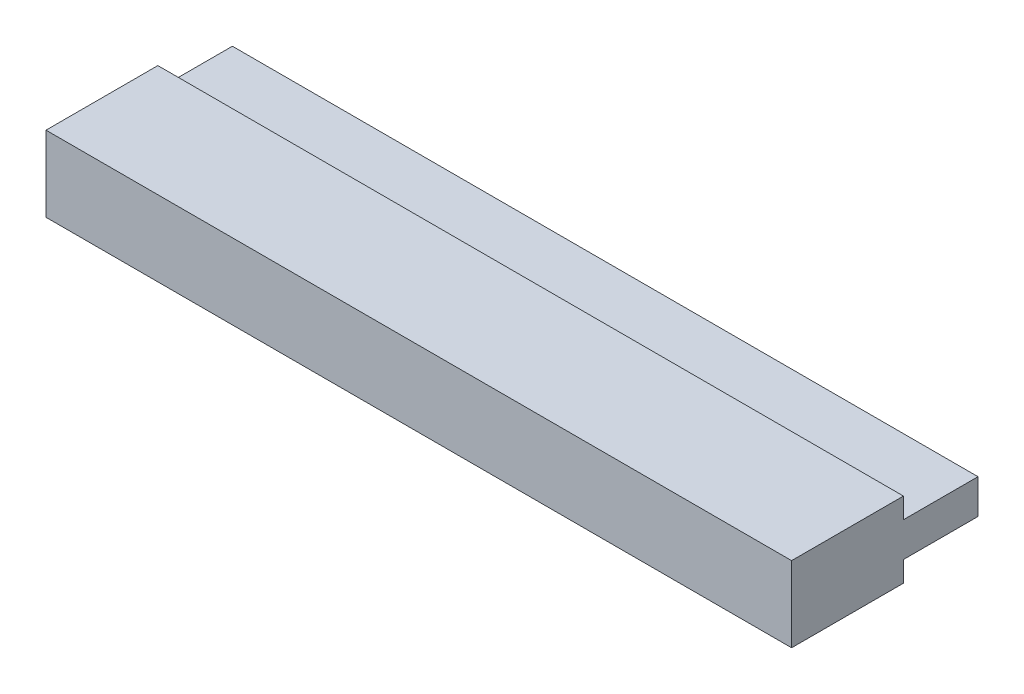
ISO-10303-21;
HEADER;
FILE_DESCRIPTION(('STEP AP214'),'2;1');
FILE_NAME('part.step','',(''),(''),'','','');
FILE_SCHEMA(('AUTOMOTIVE_DESIGN { 1 0 10303 214 1 1 1 1 }'));
ENDSEC;
DATA;
#1=APPLICATION_CONTEXT('core data for automotive mechanical design processes');
#2=APPLICATION_PROTOCOL_DEFINITION('international standard','automotive_design',2000,#1);
#3=PRODUCT_CONTEXT('',#1,'mechanical');
#4=PRODUCT('Part','Part','',(#3));
#5=PRODUCT_RELATED_PRODUCT_CATEGORY('part','',(#4));
#6=PRODUCT_DEFINITION_FORMATION('','',#4);
#7=PRODUCT_DEFINITION_CONTEXT('part definition',#1,'design');
#8=PRODUCT_DEFINITION('design','',#6,#7);
#9=PRODUCT_DEFINITION_SHAPE('','',#8);
#10=(LENGTH_UNIT() NAMED_UNIT(*) SI_UNIT(.MILLI.,.METRE.));
#11=(NAMED_UNIT(*) PLANE_ANGLE_UNIT() SI_UNIT($,.RADIAN.));
#12=(NAMED_UNIT(*) SI_UNIT($,.STERADIAN.) SOLID_ANGLE_UNIT());
#13=UNCERTAINTY_MEASURE_WITH_UNIT(LENGTH_MEASURE(1.E-05),#10,'distance_accuracy_value','');
#14=(GEOMETRIC_REPRESENTATION_CONTEXT(3) GLOBAL_UNCERTAINTY_ASSIGNED_CONTEXT((#13)) GLOBAL_UNIT_ASSIGNED_CONTEXT((#10,
#11,#12)) REPRESENTATION_CONTEXT('',''));
#15=CARTESIAN_POINT('',(0.,0.,0.));
#16=DIRECTION('',(0.,0.,1.));
#17=DIRECTION('',(1.,0.,0.));
#18=AXIS2_PLACEMENT_3D('',#15,#16,#17);
#19=CARTESIAN_POINT('',(0.,0.,20.));
#20=DIRECTION('',(1.,0.,0.));
#21=DIRECTION('',(0.,0.,-1.));
#22=AXIS2_PLACEMENT_3D('',#19,#20,#21);
#23=PLANE('',#22);
#24=DIRECTION('',(0.,0.,-1.));
#25=VECTOR('',#24,1.);
#26=CARTESIAN_POINT('',(0.,8.1,20.));
#27=LINE('',#26,#25);
#28=CARTESIAN_POINT('',(0.,8.1,20.));
#29=VERTEX_POINT('',#28);
#30=CARTESIAN_POINT('',(0.,8.1,8.));
#31=VERTEX_POINT('',#30);
#32=EDGE_CURVE('E139',#29,#31,#27,.T.);
#33=ORIENTED_EDGE('',*,*,#32,.T.);
#34=DIRECTION('',(0.,1.,0.));
#35=VECTOR('',#34,1.);
#36=CARTESIAN_POINT('',(0.,8.1,8.));
#37=LINE('',#36,#35);
#38=CARTESIAN_POINT('',(0.,5.9,8.));
#39=VERTEX_POINT('',#38);
#40=EDGE_CURVE('E120',#39,#31,#37,.T.);
#41=ORIENTED_EDGE('',*,*,#40,.F.);
#42=DIRECTION('',(0.,0.,1.));
#43=VECTOR('',#42,1.);
#44=CARTESIAN_POINT('',(0.,5.9,8.));
#45=LINE('',#44,#43);
#46=CARTESIAN_POINT('',(0.,5.9,0.));
#47=VERTEX_POINT('',#46);
#48=EDGE_CURVE('E108',#47,#39,#45,.T.);
#49=ORIENTED_EDGE('',*,*,#48,.F.);
#50=DIRECTION('',(0.,-1.,0.));
#51=VECTOR('',#50,1.);
#52=CARTESIAN_POINT('',(0.,0.,0.));
#53=LINE('',#52,#51);
#54=CARTESIAN_POINT('',(0.,2.2,0.));
#55=VERTEX_POINT('',#54);
#56=EDGE_CURVE('E119',#47,#55,#53,.T.);
#57=ORIENTED_EDGE('',*,*,#56,.T.);
#58=DIRECTION('',(0.,0.,-1.));
#59=VECTOR('',#58,1.);
#60=CARTESIAN_POINT('',(0.,2.2,1.00646922424426));
#61=LINE('',#60,#59);
#62=CARTESIAN_POINT('',(0.,2.2,8.));
#63=VERTEX_POINT('',#62);
#64=EDGE_CURVE('E65',#63,#55,#61,.T.);
#65=ORIENTED_EDGE('',*,*,#64,.F.);
#66=DIRECTION('',(0.,1.,0.));
#67=VECTOR('',#66,1.);
#68=CARTESIAN_POINT('',(0.,2.2,8.));
#69=LINE('',#68,#67);
#70=CARTESIAN_POINT('',(0.,0.,8.));
#71=VERTEX_POINT('',#70);
#72=EDGE_CURVE('E122',#71,#63,#69,.T.);
#73=ORIENTED_EDGE('',*,*,#72,.F.);
#74=DIRECTION('',(0.,0.,-1.));
#75=VECTOR('',#74,1.);
#76=CARTESIAN_POINT('',(0.,0.,20.));
#77=LINE('',#76,#75);
#78=CARTESIAN_POINT('',(0.,0.,20.));
#79=VERTEX_POINT('',#78);
#80=EDGE_CURVE('E150',#79,#71,#77,.T.);
#81=ORIENTED_EDGE('',*,*,#80,.F.);
#82=DIRECTION('',(0.,-1.,0.));
#83=VECTOR('',#82,1.);
#84=CARTESIAN_POINT('',(0.,0.,20.));
#85=LINE('',#84,#83);
#86=EDGE_CURVE('E131',#29,#79,#85,.T.);
#87=ORIENTED_EDGE('',*,*,#86,.F.);
#88=EDGE_LOOP('',(#33,#41,#49,#57,#65,#73,#81,#87));
#89=FACE_BOUND('',#88,.T.);
#90=ADVANCED_FACE('F42',(#89),#23,.F.);
#91=CARTESIAN_POINT('',(0.,0.,20.));
#92=DIRECTION('',(0.,1.,0.));
#93=DIRECTION('',(0.,0.,1.));
#94=AXIS2_PLACEMENT_3D('',#91,#92,#93);
#95=PLANE('',#94);
#96=ORIENTED_EDGE('',*,*,#80,.T.);
#97=DIRECTION('',(-1.,0.,0.));
#98=VECTOR('',#97,1.);
#99=CARTESIAN_POINT('',(85.,0.,8.));
#100=LINE('',#99,#98);
#101=CARTESIAN_POINT('',(80.,0.,8.));
#102=VERTEX_POINT('',#101);
#103=EDGE_CURVE('E197',#102,#71,#100,.T.);
#104=ORIENTED_EDGE('',*,*,#103,.F.);
#105=DIRECTION('',(0.,0.,-1.));
#106=VECTOR('',#105,1.);
#107=CARTESIAN_POINT('',(80.,0.,20.));
#108=LINE('',#107,#106);
#109=CARTESIAN_POINT('',(80.,0.,20.));
#110=VERTEX_POINT('',#109);
#111=EDGE_CURVE('E146',#110,#102,#108,.T.);
#112=ORIENTED_EDGE('',*,*,#111,.F.);
#113=DIRECTION('',(1.,0.,0.));
#114=VECTOR('',#113,1.);
#115=CARTESIAN_POINT('',(0.,0.,20.));
#116=LINE('',#115,#114);
#117=EDGE_CURVE('E176',#79,#110,#116,.T.);
#118=ORIENTED_EDGE('',*,*,#117,.F.);
#119=EDGE_LOOP('',(#96,#104,#112,#118));
#120=FACE_BOUND('',#119,.T.);
#121=ADVANCED_FACE('F195',(#120),#95,.F.);
#122=CARTESIAN_POINT('',(80.,0.,20.));
#123=DIRECTION('',(-1.,0.,0.));
#124=DIRECTION('',(0.,0.,1.));
#125=AXIS2_PLACEMENT_3D('',#122,#123,#124);
#126=PLANE('',#125);
#127=DIRECTION('',(0.,0.,1.));
#128=VECTOR('',#127,1.);
#129=CARTESIAN_POINT('',(80.,5.9,20.));
#130=LINE('',#129,#128);
#131=CARTESIAN_POINT('',(80.,5.9,0.));
#132=VERTEX_POINT('',#131);
#133=CARTESIAN_POINT('',(80.,5.9,8.));
#134=VERTEX_POINT('',#133);
#135=EDGE_CURVE('E57',#132,#134,#130,.T.);
#136=ORIENTED_EDGE('',*,*,#135,.T.);
#137=DIRECTION('',(0.,1.,0.));
#138=VECTOR('',#137,1.);
#139=CARTESIAN_POINT('',(80.,0.,8.));
#140=LINE('',#139,#138);
#141=CARTESIAN_POINT('',(80.,8.1,8.));
#142=VERTEX_POINT('',#141);
#143=EDGE_CURVE('E127',#134,#142,#140,.T.);
#144=ORIENTED_EDGE('',*,*,#143,.T.);
#145=DIRECTION('',(0.,0.,-1.));
#146=VECTOR('',#145,1.);
#147=CARTESIAN_POINT('',(80.,8.1,20.));
#148=LINE('',#147,#146);
#149=CARTESIAN_POINT('',(80.,8.1,20.));
#150=VERTEX_POINT('',#149);
#151=EDGE_CURVE('E142',#150,#142,#148,.T.);
#152=ORIENTED_EDGE('',*,*,#151,.F.);
#153=DIRECTION('',(0.,1.,0.));
#154=VECTOR('',#153,1.);
#155=CARTESIAN_POINT('',(80.,0.,20.));
#156=LINE('',#155,#154);
#157=EDGE_CURVE('E178',#110,#150,#156,.T.);
#158=ORIENTED_EDGE('',*,*,#157,.F.);
#159=ORIENTED_EDGE('',*,*,#111,.T.);
#160=DIRECTION('',(0.,1.,0.));
#161=VECTOR('',#160,1.);
#162=CARTESIAN_POINT('',(80.,0.,8.));
#163=LINE('',#162,#161);
#164=CARTESIAN_POINT('',(80.,2.2,8.));
#165=VERTEX_POINT('',#164);
#166=EDGE_CURVE('E11',#102,#165,#163,.T.);
#167=ORIENTED_EDGE('',*,*,#166,.T.);
#168=DIRECTION('',(0.,0.,-1.));
#169=VECTOR('',#168,1.);
#170=CARTESIAN_POINT('',(80.,2.2,20.));
#171=LINE('',#170,#169);
#172=CARTESIAN_POINT('',(80.,2.2,0.));
#173=VERTEX_POINT('',#172);
#174=EDGE_CURVE('E157',#165,#173,#171,.T.);
#175=ORIENTED_EDGE('',*,*,#174,.T.);
#176=DIRECTION('',(0.,1.,0.));
#177=VECTOR('',#176,1.);
#178=CARTESIAN_POINT('',(80.,0.,0.));
#179=LINE('',#178,#177);
#180=EDGE_CURVE('E126',#173,#132,#179,.T.);
#181=ORIENTED_EDGE('',*,*,#180,.T.);
#182=EDGE_LOOP('',(#136,#144,#152,#158,#159,#167,#175,#181));
#183=FACE_BOUND('',#182,.T.);
#184=ADVANCED_FACE('F160',(#183),#126,.F.);
#185=CARTESIAN_POINT('',(0.,8.1,20.));
#186=DIRECTION('',(0.,-1.,0.));
#187=DIRECTION('',(0.,0.,-1.));
#188=AXIS2_PLACEMENT_3D('',#185,#186,#187);
#189=PLANE('',#188);
#190=ORIENTED_EDGE('',*,*,#151,.T.);
#191=DIRECTION('',(-1.,0.,0.));
#192=VECTOR('',#191,1.);
#193=CARTESIAN_POINT('',(85.,8.1,8.));
#194=LINE('',#193,#192);
#195=EDGE_CURVE('E162',#142,#31,#194,.T.);
#196=ORIENTED_EDGE('',*,*,#195,.T.);
#197=ORIENTED_EDGE('',*,*,#32,.F.);
#198=DIRECTION('',(-1.,0.,0.));
#199=VECTOR('',#198,1.);
#200=CARTESIAN_POINT('',(0.,8.1,20.));
#201=LINE('',#200,#199);
#202=EDGE_CURVE('E136',#150,#29,#201,.T.);
#203=ORIENTED_EDGE('',*,*,#202,.F.);
#204=EDGE_LOOP('',(#190,#196,#197,#203));
#205=FACE_BOUND('',#204,.T.);
#206=ADVANCED_FACE('F190',(#205),#189,.F.);
#207=CARTESIAN_POINT('',(0.,0.,20.));
#208=DIRECTION('',(0.,0.,-1.));
#209=DIRECTION('',(-1.,0.,0.));
#210=AXIS2_PLACEMENT_3D('',#207,#208,#209);
#211=PLANE('',#210);
#212=ORIENTED_EDGE('',*,*,#86,.T.);
#213=ORIENTED_EDGE('',*,*,#117,.T.);
#214=ORIENTED_EDGE('',*,*,#157,.T.);
#215=ORIENTED_EDGE('',*,*,#202,.T.);
#216=EDGE_LOOP('',(#212,#213,#214,#215));
#217=FACE_BOUND('',#216,.T.);
#218=ADVANCED_FACE('F186',(#217),#211,.F.);
#219=CARTESIAN_POINT('',(0.,0.,0.));
#220=DIRECTION('',(0.,0.,-1.));
#221=DIRECTION('',(-1.,0.,0.));
#222=AXIS2_PLACEMENT_3D('',#219,#220,#221);
#223=PLANE('',#222);
#224=DIRECTION('',(-1.,0.,0.));
#225=VECTOR('',#224,1.);
#226=CARTESIAN_POINT('',(0.,5.9,0.));
#227=LINE('',#226,#225);
#228=EDGE_CURVE('E50',#132,#47,#227,.T.);
#229=ORIENTED_EDGE('',*,*,#228,.F.);
#230=ORIENTED_EDGE('',*,*,#180,.F.);
#231=DIRECTION('',(1.,0.,0.));
#232=VECTOR('',#231,1.);
#233=CARTESIAN_POINT('',(0.,2.2,0.));
#234=LINE('',#233,#232);
#235=EDGE_CURVE('E115',#55,#173,#234,.T.);
#236=ORIENTED_EDGE('',*,*,#235,.F.);
#237=ORIENTED_EDGE('',*,*,#56,.F.);
#238=EDGE_LOOP('',(#229,#230,#236,#237));
#239=FACE_BOUND('',#238,.T.);
#240=ADVANCED_FACE('F124',(#239),#223,.T.);
#241=CARTESIAN_POINT('',(85.,2.2,8.));
#242=DIRECTION('',(0.,0.,1.));
#243=DIRECTION('',(0.,-1.,0.));
#244=AXIS2_PLACEMENT_3D('',#241,#242,#243);
#245=PLANE('',#244);
#246=ORIENTED_EDGE('',*,*,#103,.T.);
#247=ORIENTED_EDGE('',*,*,#72,.T.);
#248=DIRECTION('',(-1.,0.,0.));
#249=VECTOR('',#248,1.);
#250=CARTESIAN_POINT('',(85.,2.2,8.));
#251=LINE('',#250,#249);
#252=EDGE_CURVE('E205',#165,#63,#251,.T.);
#253=ORIENTED_EDGE('',*,*,#252,.F.);
#254=ORIENTED_EDGE('',*,*,#166,.F.);
#255=EDGE_LOOP('',(#246,#247,#253,#254));
#256=FACE_BOUND('',#255,.T.);
#257=ADVANCED_FACE('F212',(#256),#245,.F.);
#258=CARTESIAN_POINT('',(85.,2.2,1.00646922424426));
#259=DIRECTION('',(0.,1.,0.));
#260=DIRECTION('',(0.,0.,1.));
#261=AXIS2_PLACEMENT_3D('',#258,#259,#260);
#262=PLANE('',#261);
#263=ORIENTED_EDGE('',*,*,#252,.T.);
#264=ORIENTED_EDGE('',*,*,#64,.T.);
#265=ORIENTED_EDGE('',*,*,#235,.T.);
#266=ORIENTED_EDGE('',*,*,#174,.F.);
#267=EDGE_LOOP('',(#263,#264,#265,#266));
#268=FACE_BOUND('',#267,.T.);
#269=ADVANCED_FACE('F156',(#268),#262,.F.);
#270=CARTESIAN_POINT('',(85.,8.1,8.));
#271=DIRECTION('',(0.,0.,1.));
#272=DIRECTION('',(1.,0.,0.));
#273=AXIS2_PLACEMENT_3D('',#270,#271,#272);
#274=PLANE('',#273);
#275=DIRECTION('',(-1.,0.,0.));
#276=VECTOR('',#275,1.);
#277=CARTESIAN_POINT('',(85.,5.9,8.));
#278=LINE('',#277,#276);
#279=EDGE_CURVE('E168',#134,#39,#278,.T.);
#280=ORIENTED_EDGE('',*,*,#279,.T.);
#281=ORIENTED_EDGE('',*,*,#40,.T.);
#282=ORIENTED_EDGE('',*,*,#195,.F.);
#283=ORIENTED_EDGE('',*,*,#143,.F.);
#284=EDGE_LOOP('',(#280,#281,#282,#283));
#285=FACE_BOUND('',#284,.T.);
#286=ADVANCED_FACE('F199',(#285),#274,.F.);
#287=CARTESIAN_POINT('',(85.,5.9,8.));
#288=DIRECTION('',(0.,-1.,0.));
#289=DIRECTION('',(0.,0.,-1.));
#290=AXIS2_PLACEMENT_3D('',#287,#288,#289);
#291=PLANE('',#290);
#292=ORIENTED_EDGE('',*,*,#228,.T.);
#293=ORIENTED_EDGE('',*,*,#48,.T.);
#294=ORIENTED_EDGE('',*,*,#279,.F.);
#295=ORIENTED_EDGE('',*,*,#135,.F.);
#296=EDGE_LOOP('',(#292,#293,#294,#295));
#297=FACE_BOUND('',#296,.T.);
#298=ADVANCED_FACE('F107',(#297),#291,.F.);
#299=CLOSED_SHELL('',(#90,#121,#184,#206,#218,#240,#257,#269,#286,#298));
#300=MANIFOLD_SOLID_BREP('B2',#299);
#301=ADVANCED_BREP_SHAPE_REPRESENTATION('',(#18,#300),#14);
#302=SHAPE_DEFINITION_REPRESENTATION(#9,#301);
ENDSEC;
END-ISO-10303-21;
